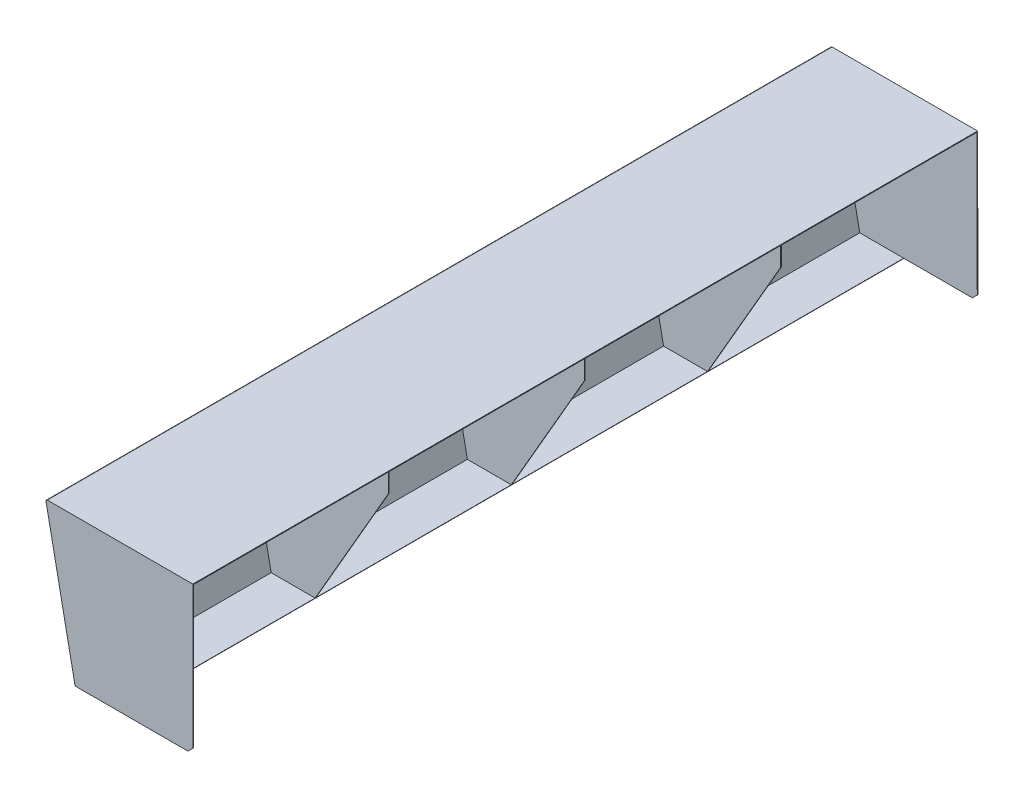
ISO-10303-21;
HEADER;
FILE_DESCRIPTION(('STEP AP214'),'2;1');
FILE_NAME('part.step','',(''),(''),'','','');
FILE_SCHEMA(('AUTOMOTIVE_DESIGN { 1 0 10303 214 1 1 1 1 }'));
ENDSEC;
DATA;
#1=APPLICATION_CONTEXT('core data for automotive mechanical design processes');
#2=APPLICATION_PROTOCOL_DEFINITION('international standard','automotive_design',2000,#1);
#3=PRODUCT_CONTEXT('',#1,'mechanical');
#4=PRODUCT('Part','Part','',(#3));
#5=PRODUCT_RELATED_PRODUCT_CATEGORY('part','',(#4));
#6=PRODUCT_DEFINITION_FORMATION('','',#4);
#7=PRODUCT_DEFINITION_CONTEXT('part definition',#1,'design');
#8=PRODUCT_DEFINITION('design','',#6,#7);
#9=PRODUCT_DEFINITION_SHAPE('','',#8);
#10=(LENGTH_UNIT() NAMED_UNIT(*) SI_UNIT(.MILLI.,.METRE.));
#11=(NAMED_UNIT(*) PLANE_ANGLE_UNIT() SI_UNIT($,.RADIAN.));
#12=(NAMED_UNIT(*) SI_UNIT($,.STERADIAN.) SOLID_ANGLE_UNIT());
#13=UNCERTAINTY_MEASURE_WITH_UNIT(LENGTH_MEASURE(1.E-05),#10,'distance_accuracy_value','');
#14=(GEOMETRIC_REPRESENTATION_CONTEXT(3) GLOBAL_UNCERTAINTY_ASSIGNED_CONTEXT((#13)) GLOBAL_UNIT_ASSIGNED_CONTEXT((#10,
#11,#12)) REPRESENTATION_CONTEXT('',''));
#15=CARTESIAN_POINT('',(0.,0.,0.));
#16=DIRECTION('',(0.,0.,1.));
#17=DIRECTION('',(1.,0.,0.));
#18=AXIS2_PLACEMENT_3D('',#15,#16,#17);
#19=CARTESIAN_POINT('',(300.,260.,0.));
#20=DIRECTION('',(-0.8661855860486,0.499722453489577,0.));
#21=DIRECTION('',(-0.499722453489577,-0.866185586048601,0.));
#22=AXIS2_PLACEMENT_3D('',#19,#20,#21);
#23=PLANE('',#22);
#24=DIRECTION('',(0.,0.,-1.));
#25=VECTOR('',#24,1.);
#26=CARTESIAN_POINT('',(150.865384615385,1.49999999999989,1.5));
#27=LINE('',#26,#25);
#28=CARTESIAN_POINT('',(150.865384615385,1.49999999999989,1.5));
#29=VERTEX_POINT('',#28);
#30=CARTESIAN_POINT('',(150.865384615385,1.49999999999989,0.));
#31=VERTEX_POINT('',#30);
#32=EDGE_CURVE('E255',#29,#31,#27,.T.);
#33=ORIENTED_EDGE('',*,*,#32,.F.);
#34=DIRECTION('',(0.,0.,1.));
#35=VECTOR('',#34,1.);
#36=CARTESIAN_POINT('',(150.865384615385,1.5,1600.));
#37=LINE('',#36,#35);
#38=CARTESIAN_POINT('',(150.865384615385,1.5,400.000000000001));
#39=VERTEX_POINT('',#38);
#40=EDGE_CURVE('E387',#29,#39,#37,.T.);
#41=ORIENTED_EDGE('',*,*,#40,.T.);
#42=DIRECTION('',(0.499722453489577,0.8661855860486,0.));
#43=VECTOR('',#42,1.);
#44=CARTESIAN_POINT('',(150.865384615385,1.5,400.));
#45=LINE('',#44,#43);
#46=CARTESIAN_POINT('',(300.,260.,400.));
#47=VERTEX_POINT('',#46);
#48=EDGE_CURVE('E304',#39,#47,#45,.T.);
#49=ORIENTED_EDGE('',*,*,#48,.T.);
#50=DIRECTION('',(0.,0.,-1.));
#51=VECTOR('',#50,1.);
#52=CARTESIAN_POINT('',(300.,260.,401.5));
#53=LINE('',#52,#51);
#54=CARTESIAN_POINT('',(300.,260.,401.5));
#55=VERTEX_POINT('',#54);
#56=EDGE_CURVE('E297',#55,#47,#53,.T.);
#57=ORIENTED_EDGE('',*,*,#56,.F.);
#58=DIRECTION('',(0.499722453489577,0.8661855860486,0.));
#59=VECTOR('',#58,1.);
#60=CARTESIAN_POINT('',(150.865384615385,1.5,401.5));
#61=LINE('',#60,#59);
#62=CARTESIAN_POINT('',(150.865384615385,1.5,401.500000000001));
#63=VERTEX_POINT('',#62);
#64=EDGE_CURVE('E292',#63,#55,#61,.T.);
#65=ORIENTED_EDGE('',*,*,#64,.F.);
#66=CARTESIAN_POINT('',(150.865384615385,1.5,800.));
#67=VERTEX_POINT('',#66);
#68=EDGE_CURVE('E405',#63,#67,#37,.T.);
#69=ORIENTED_EDGE('',*,*,#68,.T.);
#70=DIRECTION('',(0.499722453489577,0.8661855860486,0.));
#71=VECTOR('',#70,1.);
#72=CARTESIAN_POINT('',(150.865384615385,1.5,800.));
#73=LINE('',#72,#71);
#74=CARTESIAN_POINT('',(300.,260.,800.));
#75=VERTEX_POINT('',#74);
#76=EDGE_CURVE('E335',#67,#75,#73,.T.);
#77=ORIENTED_EDGE('',*,*,#76,.T.);
#78=DIRECTION('',(0.,0.,-1.));
#79=VECTOR('',#78,1.);
#80=CARTESIAN_POINT('',(300.,260.,801.5));
#81=LINE('',#80,#79);
#82=CARTESIAN_POINT('',(300.,260.,801.5));
#83=VERTEX_POINT('',#82);
#84=EDGE_CURVE('E326',#83,#75,#81,.T.);
#85=ORIENTED_EDGE('',*,*,#84,.F.);
#86=DIRECTION('',(0.499722453489577,0.8661855860486,0.));
#87=VECTOR('',#86,1.);
#88=CARTESIAN_POINT('',(150.865384615385,1.5,801.5));
#89=LINE('',#88,#87);
#90=CARTESIAN_POINT('',(150.865384615385,1.5,801.5));
#91=VERTEX_POINT('',#90);
#92=EDGE_CURVE('E321',#91,#83,#89,.T.);
#93=ORIENTED_EDGE('',*,*,#92,.F.);
#94=CARTESIAN_POINT('',(150.865384615385,1.5,1200.));
#95=VERTEX_POINT('',#94);
#96=EDGE_CURVE('E602',#91,#95,#37,.T.);
#97=ORIENTED_EDGE('',*,*,#96,.T.);
#98=DIRECTION('',(0.499722453489577,0.8661855860486,0.));
#99=VECTOR('',#98,1.);
#100=CARTESIAN_POINT('',(150.865384615385,1.5,1200.));
#101=LINE('',#100,#99);
#102=CARTESIAN_POINT('',(300.,260.,1200.));
#103=VERTEX_POINT('',#102);
#104=EDGE_CURVE('E366',#95,#103,#101,.T.);
#105=ORIENTED_EDGE('',*,*,#104,.T.);
#106=DIRECTION('',(0.,0.,-1.));
#107=VECTOR('',#106,1.);
#108=CARTESIAN_POINT('',(300.,260.,1201.5));
#109=LINE('',#108,#107);
#110=CARTESIAN_POINT('',(300.,260.,1201.5));
#111=VERTEX_POINT('',#110);
#112=EDGE_CURVE('E357',#111,#103,#109,.T.);
#113=ORIENTED_EDGE('',*,*,#112,.F.);
#114=DIRECTION('',(0.499722453489577,0.8661855860486,0.));
#115=VECTOR('',#114,1.);
#116=CARTESIAN_POINT('',(150.865384615385,1.5,1201.5));
#117=LINE('',#116,#115);
#118=CARTESIAN_POINT('',(150.865384615385,1.5,1201.5));
#119=VERTEX_POINT('',#118);
#120=EDGE_CURVE('E352',#119,#111,#117,.T.);
#121=ORIENTED_EDGE('',*,*,#120,.F.);
#122=CARTESIAN_POINT('',(150.865384615385,1.49999999999989,1598.5));
#123=VERTEX_POINT('',#122);
#124=EDGE_CURVE('E381',#119,#123,#37,.T.);
#125=ORIENTED_EDGE('',*,*,#124,.T.);
#126=DIRECTION('',(-0.499722453489577,-0.866185586048601,0.));
#127=VECTOR('',#126,1.);
#128=CARTESIAN_POINT('',(300.,260.,1598.5));
#129=LINE('',#128,#127);
#130=CARTESIAN_POINT('',(150.,0.,1598.5));
#131=VERTEX_POINT('',#130);
#132=EDGE_CURVE('E265',#123,#131,#129,.T.);
#133=ORIENTED_EDGE('',*,*,#132,.T.);
#134=DIRECTION('',(0.,0.,1.));
#135=VECTOR('',#134,1.);
#136=CARTESIAN_POINT('',(150.,0.,0.));
#137=LINE('',#136,#135);
#138=CARTESIAN_POINT('',(150.,0.,0.));
#139=VERTEX_POINT('',#138);
#140=EDGE_CURVE('E422',#139,#131,#137,.T.);
#141=ORIENTED_EDGE('',*,*,#140,.F.);
#142=DIRECTION('',(-0.499722453489577,-0.8661855860486,0.));
#143=VECTOR('',#142,1.);
#144=CARTESIAN_POINT('',(300.,260.,0.));
#145=LINE('',#144,#143);
#146=EDGE_CURVE('E420',#31,#139,#145,.T.);
#147=ORIENTED_EDGE('',*,*,#146,.F.);
#148=EDGE_LOOP('',(#33,#41,#49,#57,#65,#69,#77,#85,#93,#97,#105,#113,#121,#125,#133,#141,#147));
#149=FACE_BOUND('',#148,.T.);
#150=ADVANCED_FACE('F35',(#149),#23,.F.);
#151=CARTESIAN_POINT('',(0.,1.5,1600.));
#152=DIRECTION('',(0.,1.,0.));
#153=DIRECTION('',(0.,0.,1.));
#154=AXIS2_PLACEMENT_3D('',#151,#152,#153);
#155=PLANE('',#154);
#156=ORIENTED_EDGE('',*,*,#68,.F.);
#157=DIRECTION('',(1.,0.,0.));
#158=VECTOR('',#157,1.);
#159=CARTESIAN_POINT('',(61.2297058540778,1.5,401.5));
#160=LINE('',#159,#158);
#161=CARTESIAN_POINT('',(61.2297058540778,1.5,401.5));
#162=VERTEX_POINT('',#161);
#163=EDGE_CURVE('E289',#162,#63,#160,.T.);
#164=ORIENTED_EDGE('',*,*,#163,.F.);
#165=DIRECTION('',(0.,0.,1.));
#166=VECTOR('',#165,1.);
#167=CARTESIAN_POINT('',(61.2297058540778,1.5,0.));
#168=LINE('',#167,#166);
#169=CARTESIAN_POINT('',(61.2297058540778,1.5,800.));
#170=VERTEX_POINT('',#169);
#171=EDGE_CURVE('E382',#162,#170,#168,.T.);
#172=ORIENTED_EDGE('',*,*,#171,.T.);
#173=DIRECTION('',(1.,0.,0.));
#174=VECTOR('',#173,1.);
#175=CARTESIAN_POINT('',(61.2297058540778,1.5,800.));
#176=LINE('',#175,#174);
#177=EDGE_CURVE('E332',#170,#67,#176,.T.);
#178=ORIENTED_EDGE('',*,*,#177,.T.);
#179=EDGE_LOOP('',(#156,#164,#172,#178));
#180=FACE_BOUND('',#179,.T.);
#181=ADVANCED_FACE('F481',(#180),#155,.T.);
#182=CARTESIAN_POINT('',(0.,298.5,1600.));
#183=DIRECTION('',(0.,-1.,0.));
#184=DIRECTION('',(0.,0.,-1.));
#185=AXIS2_PLACEMENT_3D('',#182,#183,#184);
#186=PLANE('',#185);
#187=DIRECTION('',(0.,0.,-1.));
#188=VECTOR('',#187,1.);
#189=CARTESIAN_POINT('',(1.82970585407782,298.5,0.));
#190=LINE('',#189,#188);
#191=CARTESIAN_POINT('',(1.82970585407782,298.5,800.));
#192=VERTEX_POINT('',#191);
#193=CARTESIAN_POINT('',(1.82970585407782,298.5,401.5));
#194=VERTEX_POINT('',#193);
#195=EDGE_CURVE('E560',#192,#194,#190,.T.);
#196=ORIENTED_EDGE('',*,*,#195,.T.);
#197=DIRECTION('',(-1.,0.,0.));
#198=VECTOR('',#197,1.);
#199=CARTESIAN_POINT('',(300.,298.5,401.5));
#200=LINE('',#199,#198);
#201=CARTESIAN_POINT('',(300.,298.5,401.5));
#202=VERTEX_POINT('',#201);
#203=EDGE_CURVE('E282',#202,#194,#200,.T.);
#204=ORIENTED_EDGE('',*,*,#203,.F.);
#205=DIRECTION('',(0.,0.,-1.));
#206=VECTOR('',#205,1.);
#207=CARTESIAN_POINT('',(300.,298.5,1600.));
#208=LINE('',#207,#206);
#209=CARTESIAN_POINT('',(300.,298.5,800.));
#210=VERTEX_POINT('',#209);
#211=EDGE_CURVE('E559',#210,#202,#208,.T.);
#212=ORIENTED_EDGE('',*,*,#211,.F.);
#213=DIRECTION('',(-1.,0.,0.));
#214=VECTOR('',#213,1.);
#215=CARTESIAN_POINT('',(300.,298.5,800.));
#216=LINE('',#215,#214);
#217=EDGE_CURVE('E310',#210,#192,#216,.T.);
#218=ORIENTED_EDGE('',*,*,#217,.T.);
#219=EDGE_LOOP('',(#196,#204,#212,#218));
#220=FACE_BOUND('',#219,.T.);
#221=ADVANCED_FACE('F488',(#220),#186,.T.);
#222=CARTESIAN_POINT('',(61.4708710135364,0.294174202707276,0.));
#223=DIRECTION('',(0.98058067569092,0.196116135138184,0.));
#224=DIRECTION('',(-0.196116135138184,0.98058067569092,0.));
#225=AXIS2_PLACEMENT_3D('',#222,#223,#224);
#226=PLANE('',#225);
#227=ORIENTED_EDGE('',*,*,#171,.F.);
#228=DIRECTION('',(0.196116135138184,-0.98058067569092,0.));
#229=VECTOR('',#228,1.);
#230=CARTESIAN_POINT('',(1.82970585407782,298.5,401.5));
#231=LINE('',#230,#229);
#232=EDGE_CURVE('E285',#194,#162,#231,.T.);
#233=ORIENTED_EDGE('',*,*,#232,.F.);
#234=ORIENTED_EDGE('',*,*,#195,.F.);
#235=DIRECTION('',(0.196116135138184,-0.98058067569092,0.));
#236=VECTOR('',#235,1.);
#237=CARTESIAN_POINT('',(1.82970585407782,298.5,800.));
#238=LINE('',#237,#236);
#239=EDGE_CURVE('E329',#192,#170,#238,.T.);
#240=ORIENTED_EDGE('',*,*,#239,.T.);
#241=EDGE_LOOP('',(#227,#233,#234,#240));
#242=FACE_BOUND('',#241,.T.);
#243=ADVANCED_FACE('F530',(#242),#226,.T.);
#244=ORIENTED_EDGE('',*,*,#96,.F.);
#245=DIRECTION('',(1.,0.,0.));
#246=VECTOR('',#245,1.);
#247=CARTESIAN_POINT('',(61.2297058540778,1.5,801.5));
#248=LINE('',#247,#246);
#249=CARTESIAN_POINT('',(61.2297058540778,1.5,801.5));
#250=VERTEX_POINT('',#249);
#251=EDGE_CURVE('E318',#250,#91,#248,.T.);
#252=ORIENTED_EDGE('',*,*,#251,.F.);
#253=CARTESIAN_POINT('',(61.2297058540778,1.5,1200.));
#254=VERTEX_POINT('',#253);
#255=EDGE_CURVE('E553',#250,#254,#168,.T.);
#256=ORIENTED_EDGE('',*,*,#255,.T.);
#257=DIRECTION('',(1.,0.,0.));
#258=VECTOR('',#257,1.);
#259=CARTESIAN_POINT('',(61.2297058540778,1.5,1200.));
#260=LINE('',#259,#258);
#261=EDGE_CURVE('E363',#254,#95,#260,.T.);
#262=ORIENTED_EDGE('',*,*,#261,.T.);
#263=EDGE_LOOP('',(#244,#252,#256,#262));
#264=FACE_BOUND('',#263,.T.);
#265=ADVANCED_FACE('F491',(#264),#155,.T.);
#266=CARTESIAN_POINT('',(1.82970585407782,298.5,1200.));
#267=VERTEX_POINT('',#266);
#268=CARTESIAN_POINT('',(1.82970585407782,298.5,801.5));
#269=VERTEX_POINT('',#268);
#270=EDGE_CURVE('E400',#267,#269,#190,.T.);
#271=ORIENTED_EDGE('',*,*,#270,.T.);
#272=DIRECTION('',(-1.,0.,0.));
#273=VECTOR('',#272,1.);
#274=CARTESIAN_POINT('',(300.,298.5,801.5));
#275=LINE('',#274,#273);
#276=CARTESIAN_POINT('',(300.,298.5,801.5));
#277=VERTEX_POINT('',#276);
#278=EDGE_CURVE('E311',#277,#269,#275,.T.);
#279=ORIENTED_EDGE('',*,*,#278,.F.);
#280=CARTESIAN_POINT('',(300.,298.5,1200.));
#281=VERTEX_POINT('',#280);
#282=EDGE_CURVE('E411',#281,#277,#208,.T.);
#283=ORIENTED_EDGE('',*,*,#282,.F.);
#284=DIRECTION('',(-1.,0.,0.));
#285=VECTOR('',#284,1.);
#286=CARTESIAN_POINT('',(300.,298.5,1200.));
#287=LINE('',#286,#285);
#288=EDGE_CURVE('E341',#281,#267,#287,.T.);
#289=ORIENTED_EDGE('',*,*,#288,.T.);
#290=EDGE_LOOP('',(#271,#279,#283,#289));
#291=FACE_BOUND('',#290,.T.);
#292=ADVANCED_FACE('F524',(#291),#186,.T.);
#293=ORIENTED_EDGE('',*,*,#255,.F.);
#294=DIRECTION('',(0.196116135138184,-0.98058067569092,0.));
#295=VECTOR('',#294,1.);
#296=CARTESIAN_POINT('',(1.82970585407782,298.5,801.5));
#297=LINE('',#296,#295);
#298=EDGE_CURVE('E314',#269,#250,#297,.T.);
#299=ORIENTED_EDGE('',*,*,#298,.F.);
#300=ORIENTED_EDGE('',*,*,#270,.F.);
#301=DIRECTION('',(0.196116135138184,-0.98058067569092,0.));
#302=VECTOR('',#301,1.);
#303=CARTESIAN_POINT('',(1.82970585407782,298.5,1200.));
#304=LINE('',#303,#302);
#305=EDGE_CURVE('E360',#267,#254,#304,.T.);
#306=ORIENTED_EDGE('',*,*,#305,.T.);
#307=EDGE_LOOP('',(#293,#299,#300,#306));
#308=FACE_BOUND('',#307,.T.);
#309=ADVANCED_FACE('F515',(#308),#226,.T.);
#310=ORIENTED_EDGE('',*,*,#124,.F.);
#311=DIRECTION('',(1.,0.,0.));
#312=VECTOR('',#311,1.);
#313=CARTESIAN_POINT('',(61.2297058540778,1.5,1201.5));
#314=LINE('',#313,#312);
#315=CARTESIAN_POINT('',(61.2297058540778,1.5,1201.5));
#316=VERTEX_POINT('',#315);
#317=EDGE_CURVE('E349',#316,#119,#314,.T.);
#318=ORIENTED_EDGE('',*,*,#317,.F.);
#319=CARTESIAN_POINT('',(61.2297058540778,1.5,1598.5));
#320=VERTEX_POINT('',#319);
#321=EDGE_CURVE('E383',#316,#320,#168,.T.);
#322=ORIENTED_EDGE('',*,*,#321,.T.);
#323=DIRECTION('',(1.,0.,0.));
#324=VECTOR('',#323,1.);
#325=CARTESIAN_POINT('',(0.,1.5,1598.5));
#326=LINE('',#325,#324);
#327=EDGE_CURVE('E373',#320,#123,#326,.T.);
#328=ORIENTED_EDGE('',*,*,#327,.T.);
#329=EDGE_LOOP('',(#310,#318,#322,#328));
#330=FACE_BOUND('',#329,.T.);
#331=ADVANCED_FACE('F520',(#330),#155,.T.);
#332=CARTESIAN_POINT('',(1.82970585407782,298.5,1598.5));
#333=VERTEX_POINT('',#332);
#334=CARTESIAN_POINT('',(1.82970585407782,298.5,1201.5));
#335=VERTEX_POINT('',#334);
#336=EDGE_CURVE('E396',#333,#335,#190,.T.);
#337=ORIENTED_EDGE('',*,*,#336,.T.);
#338=DIRECTION('',(-1.,0.,0.));
#339=VECTOR('',#338,1.);
#340=CARTESIAN_POINT('',(300.,298.5,1201.5));
#341=LINE('',#340,#339);
#342=CARTESIAN_POINT('',(300.,298.5,1201.5));
#343=VERTEX_POINT('',#342);
#344=EDGE_CURVE('E342',#343,#335,#341,.T.);
#345=ORIENTED_EDGE('',*,*,#344,.F.);
#346=CARTESIAN_POINT('',(300.,298.5,1598.5));
#347=VERTEX_POINT('',#346);
#348=EDGE_CURVE('E407',#347,#343,#208,.T.);
#349=ORIENTED_EDGE('',*,*,#348,.F.);
#350=DIRECTION('',(-1.,0.,0.));
#351=VECTOR('',#350,1.);
#352=CARTESIAN_POINT('',(0.,298.5,1598.5));
#353=LINE('',#352,#351);
#354=EDGE_CURVE('E388',#347,#333,#353,.T.);
#355=ORIENTED_EDGE('',*,*,#354,.T.);
#356=EDGE_LOOP('',(#337,#345,#349,#355));
#357=FACE_BOUND('',#356,.T.);
#358=ADVANCED_FACE('F512',(#357),#186,.T.);
#359=ORIENTED_EDGE('',*,*,#321,.F.);
#360=DIRECTION('',(0.196116135138184,-0.98058067569092,0.));
#361=VECTOR('',#360,1.);
#362=CARTESIAN_POINT('',(1.82970585407782,298.5,1201.5));
#363=LINE('',#362,#361);
#364=EDGE_CURVE('E345',#335,#316,#363,.T.);
#365=ORIENTED_EDGE('',*,*,#364,.F.);
#366=ORIENTED_EDGE('',*,*,#336,.F.);
#367=DIRECTION('',(-0.196116135138184,0.98058067569092,0.));
#368=VECTOR('',#367,1.);
#369=CARTESIAN_POINT('',(61.4708710135364,0.294174202707276,1598.5));
#370=LINE('',#369,#368);
#371=EDGE_CURVE('E372',#320,#333,#370,.T.);
#372=ORIENTED_EDGE('',*,*,#371,.F.);
#373=EDGE_LOOP('',(#359,#365,#366,#372));
#374=FACE_BOUND('',#373,.T.);
#375=ADVANCED_FACE('F507',(#374),#226,.T.);
#376=CARTESIAN_POINT('',(0.,0.,1600.));
#377=DIRECTION('',(0.,1.,0.));
#378=DIRECTION('',(0.,0.,1.));
#379=AXIS2_PLACEMENT_3D('',#376,#377,#378);
#380=PLANE('',#379);
#381=DIRECTION('',(1.,0.,0.));
#382=VECTOR('',#381,1.);
#383=CARTESIAN_POINT('',(0.,0.,1600.));
#384=LINE('',#383,#382);
#385=CARTESIAN_POINT('',(60.,0.,1600.));
#386=VERTEX_POINT('',#385);
#387=CARTESIAN_POINT('',(290.,0.,1600.));
#388=VERTEX_POINT('',#387);
#389=EDGE_CURVE('E427',#386,#388,#384,.T.);
#390=ORIENTED_EDGE('',*,*,#389,.F.);
#391=DIRECTION('',(0.,0.,1.));
#392=VECTOR('',#391,1.);
#393=CARTESIAN_POINT('',(60.,0.,0.));
#394=LINE('',#393,#392);
#395=CARTESIAN_POINT('',(60.,0.,0.));
#396=VERTEX_POINT('',#395);
#397=EDGE_CURVE('E416',#396,#386,#394,.T.);
#398=ORIENTED_EDGE('',*,*,#397,.F.);
#399=DIRECTION('',(1.,0.,0.));
#400=VECTOR('',#399,1.);
#401=CARTESIAN_POINT('',(0.,0.,0.));
#402=LINE('',#401,#400);
#403=EDGE_CURVE('E425',#396,#139,#402,.T.);
#404=ORIENTED_EDGE('',*,*,#403,.T.);
#405=ORIENTED_EDGE('',*,*,#140,.T.);
#406=DIRECTION('',(1.,0.,0.));
#407=VECTOR('',#406,1.);
#408=CARTESIAN_POINT('',(290.,0.,1598.5));
#409=LINE('',#408,#407);
#410=CARTESIAN_POINT('',(290.,0.,1598.5));
#411=VERTEX_POINT('',#410);
#412=EDGE_CURVE('E258',#131,#411,#409,.T.);
#413=ORIENTED_EDGE('',*,*,#412,.T.);
#414=DIRECTION('',(0.,0.,1.));
#415=VECTOR('',#414,1.);
#416=CARTESIAN_POINT('',(290.,0.,1598.5));
#417=LINE('',#416,#415);
#418=EDGE_CURVE('E274',#411,#388,#417,.T.);
#419=ORIENTED_EDGE('',*,*,#418,.T.);
#420=EDGE_LOOP('',(#390,#398,#404,#405,#413,#419));
#421=FACE_BOUND('',#420,.T.);
#422=ADVANCED_FACE('F456',(#421),#380,.F.);
#423=CARTESIAN_POINT('',(300.,0.,1600.));
#424=DIRECTION('',(-1.,0.,0.));
#425=DIRECTION('',(0.,0.,1.));
#426=AXIS2_PLACEMENT_3D('',#423,#424,#425);
#427=PLANE('',#426);
#428=DIRECTION('',(0.,1.,0.));
#429=VECTOR('',#428,1.);
#430=CARTESIAN_POINT('',(300.,0.,1600.));
#431=LINE('',#430,#429);
#432=CARTESIAN_POINT('',(300.,10.,1600.));
#433=VERTEX_POINT('',#432);
#434=CARTESIAN_POINT('',(300.,300.,1600.));
#435=VERTEX_POINT('',#434);
#436=EDGE_CURVE('E429',#433,#435,#431,.T.);
#437=ORIENTED_EDGE('',*,*,#436,.F.);
#438=DIRECTION('',(0.,0.,1.));
#439=VECTOR('',#438,1.);
#440=CARTESIAN_POINT('',(300.,10.,1598.5));
#441=LINE('',#440,#439);
#442=CARTESIAN_POINT('',(300.,10.,1598.5));
#443=VERTEX_POINT('',#442);
#444=EDGE_CURVE('E276',#443,#433,#441,.T.);
#445=ORIENTED_EDGE('',*,*,#444,.F.);
#446=DIRECTION('',(0.,1.,0.));
#447=VECTOR('',#446,1.);
#448=CARTESIAN_POINT('',(300.,0.,1598.5));
#449=LINE('',#448,#447);
#450=EDGE_CURVE('E376',#443,#347,#449,.T.);
#451=ORIENTED_EDGE('',*,*,#450,.T.);
#452=ORIENTED_EDGE('',*,*,#348,.T.);
#453=DIRECTION('',(0.,1.,0.));
#454=VECTOR('',#453,1.);
#455=CARTESIAN_POINT('',(300.,260.,1201.5));
#456=LINE('',#455,#454);
#457=EDGE_CURVE('E354',#111,#343,#456,.T.);
#458=ORIENTED_EDGE('',*,*,#457,.F.);
#459=ORIENTED_EDGE('',*,*,#112,.T.);
#460=DIRECTION('',(0.,1.,0.));
#461=VECTOR('',#460,1.);
#462=CARTESIAN_POINT('',(300.,260.,1200.));
#463=LINE('',#462,#461);
#464=EDGE_CURVE('E346',#103,#281,#463,.T.);
#465=ORIENTED_EDGE('',*,*,#464,.T.);
#466=ORIENTED_EDGE('',*,*,#282,.T.);
#467=DIRECTION('',(0.,1.,0.));
#468=VECTOR('',#467,1.);
#469=CARTESIAN_POINT('',(300.,260.,801.5));
#470=LINE('',#469,#468);
#471=EDGE_CURVE('E323',#83,#277,#470,.T.);
#472=ORIENTED_EDGE('',*,*,#471,.F.);
#473=ORIENTED_EDGE('',*,*,#84,.T.);
#474=DIRECTION('',(0.,1.,0.));
#475=VECTOR('',#474,1.);
#476=CARTESIAN_POINT('',(300.,260.,800.));
#477=LINE('',#476,#475);
#478=EDGE_CURVE('E315',#75,#210,#477,.T.);
#479=ORIENTED_EDGE('',*,*,#478,.T.);
#480=ORIENTED_EDGE('',*,*,#211,.T.);
#481=DIRECTION('',(0.,1.,0.));
#482=VECTOR('',#481,1.);
#483=CARTESIAN_POINT('',(300.,260.,401.5));
#484=LINE('',#483,#482);
#485=EDGE_CURVE('E294',#55,#202,#484,.T.);
#486=ORIENTED_EDGE('',*,*,#485,.F.);
#487=ORIENTED_EDGE('',*,*,#56,.T.);
#488=DIRECTION('',(0.,1.,0.));
#489=VECTOR('',#488,1.);
#490=CARTESIAN_POINT('',(300.,260.,400.));
#491=LINE('',#490,#489);
#492=CARTESIAN_POINT('',(300.,298.5,400.));
#493=VERTEX_POINT('',#492);
#494=EDGE_CURVE('E286',#47,#493,#491,.T.);
#495=ORIENTED_EDGE('',*,*,#494,.T.);
#496=CARTESIAN_POINT('',(300.,298.5,1.5));
#497=VERTEX_POINT('',#496);
#498=EDGE_CURVE('E399',#493,#497,#208,.T.);
#499=ORIENTED_EDGE('',*,*,#498,.T.);
#500=DIRECTION('',(0.,1.,0.));
#501=VECTOR('',#500,1.);
#502=CARTESIAN_POINT('',(300.,0.,1.5));
#503=LINE('',#502,#501);
#504=CARTESIAN_POINT('',(300.,260.,1.5));
#505=VERTEX_POINT('',#504);
#506=EDGE_CURVE('E386',#505,#497,#503,.T.);
#507=ORIENTED_EDGE('',*,*,#506,.F.);
#508=DIRECTION('',(0.,0.,1.));
#509=VECTOR('',#508,1.);
#510=CARTESIAN_POINT('',(300.,260.,0.));
#511=LINE('',#510,#509);
#512=CARTESIAN_POINT('',(300.,260.,0.));
#513=VERTEX_POINT('',#512);
#514=EDGE_CURVE('E237',#513,#505,#511,.T.);
#515=ORIENTED_EDGE('',*,*,#514,.F.);
#516=DIRECTION('',(0.,1.,0.));
#517=VECTOR('',#516,1.);
#518=CARTESIAN_POINT('',(300.,0.,0.));
#519=LINE('',#518,#517);
#520=CARTESIAN_POINT('',(300.,300.,0.));
#521=VERTEX_POINT('',#520);
#522=EDGE_CURVE('E436',#513,#521,#519,.T.);
#523=ORIENTED_EDGE('',*,*,#522,.T.);
#524=DIRECTION('',(0.,0.,-1.));
#525=VECTOR('',#524,1.);
#526=CARTESIAN_POINT('',(300.,300.,1600.));
#527=LINE('',#526,#525);
#528=EDGE_CURVE('E269',#435,#521,#527,.T.);
#529=ORIENTED_EDGE('',*,*,#528,.F.);
#530=EDGE_LOOP('',(#437,#445,#451,#452,#458,#459,#465,#466,#472,#473,#479,#480,#486,#487,#495,
#499,#507,#515,#523,#529));
#531=FACE_BOUND('',#530,.T.);
#532=ADVANCED_FACE('F503',(#531),#427,.F.);
#533=CARTESIAN_POINT('',(0.,300.,1600.));
#534=DIRECTION('',(0.,-1.,0.));
#535=DIRECTION('',(0.,0.,-1.));
#536=AXIS2_PLACEMENT_3D('',#533,#534,#535);
#537=PLANE('',#536);
#538=DIRECTION('',(-1.,0.,0.));
#539=VECTOR('',#538,1.);
#540=CARTESIAN_POINT('',(0.,300.,0.));
#541=LINE('',#540,#539);
#542=CARTESIAN_POINT('',(3.65941170815567,300.,0.));
#543=VERTEX_POINT('',#542);
#544=EDGE_CURVE('E430',#521,#543,#541,.T.);
#545=ORIENTED_EDGE('',*,*,#544,.T.);
#546=DIRECTION('',(0.,0.,-1.));
#547=VECTOR('',#546,1.);
#548=CARTESIAN_POINT('',(3.65941170815567,300.,1600.));
#549=LINE('',#548,#547);
#550=CARTESIAN_POINT('',(3.65941170815567,300.,1600.));
#551=VERTEX_POINT('',#550);
#552=EDGE_CURVE('E43',#543,#551,#549,.F.);
#553=ORIENTED_EDGE('',*,*,#552,.T.);
#554=DIRECTION('',(-1.,0.,0.));
#555=VECTOR('',#554,1.);
#556=CARTESIAN_POINT('',(0.,300.,1600.));
#557=LINE('',#556,#555);
#558=EDGE_CURVE('E432',#435,#551,#557,.T.);
#559=ORIENTED_EDGE('',*,*,#558,.F.);
#560=ORIENTED_EDGE('',*,*,#528,.T.);
#561=EDGE_LOOP('',(#545,#553,#559,#560));
#562=FACE_BOUND('',#561,.T.);
#563=ADVANCED_FACE('F498',(#562),#537,.F.);
#564=CARTESIAN_POINT('',(0.,0.,1600.));
#565=DIRECTION('',(0.,0.,-1.));
#566=DIRECTION('',(-1.,0.,0.));
#567=AXIS2_PLACEMENT_3D('',#564,#565,#566);
#568=PLANE('',#567);
#569=ORIENTED_EDGE('',*,*,#558,.T.);
#570=CARTESIAN_POINT('',(3.65941170815567,297.,1600.));
#571=DIRECTION('',(0.,0.,-1.));
#572=DIRECTION('',(-1.,0.,0.));
#573=AXIS2_PLACEMENT_3D('',#570,#571,#572);
#574=CIRCLE('',#573,3.);
#575=CARTESIAN_POINT('',(0.717669681082916,296.411651594585,1600.));
#576=VERTEX_POINT('',#575);
#577=EDGE_CURVE('E11',#551,#576,#574,.F.);
#578=ORIENTED_EDGE('',*,*,#577,.T.);
#579=DIRECTION('',(-0.196116135138184,0.98058067569092,0.));
#580=VECTOR('',#579,1.);
#581=CARTESIAN_POINT('',(60.,0.,1600.));
#582=LINE('',#581,#580);
#583=EDGE_CURVE('E410',#386,#576,#582,.T.);
#584=ORIENTED_EDGE('',*,*,#583,.F.);
#585=ORIENTED_EDGE('',*,*,#389,.T.);
#586=DIRECTION('',(0.707106781186548,0.707106781186547,0.));
#587=VECTOR('',#586,1.);
#588=CARTESIAN_POINT('',(300.,10.,1600.));
#589=LINE('',#588,#587);
#590=EDGE_CURVE('E254',#388,#433,#589,.T.);
#591=ORIENTED_EDGE('',*,*,#590,.T.);
#592=ORIENTED_EDGE('',*,*,#436,.T.);
#593=EDGE_LOOP('',(#569,#578,#584,#585,#591,#592));
#594=FACE_BOUND('',#593,.T.);
#595=ADVANCED_FACE('F471',(#594),#568,.F.);
#596=CARTESIAN_POINT('',(0.,0.,0.));
#597=DIRECTION('',(0.,0.,-1.));
#598=DIRECTION('',(-1.,0.,0.));
#599=AXIS2_PLACEMENT_3D('',#596,#597,#598);
#600=PLANE('',#599);
#601=DIRECTION('',(-0.196116135138184,0.98058067569092,0.));
#602=VECTOR('',#601,1.);
#603=CARTESIAN_POINT('',(60.,0.,0.));
#604=LINE('',#603,#602);
#605=CARTESIAN_POINT('',(0.717669681082916,296.411651594585,0.));
#606=VERTEX_POINT('',#605);
#607=EDGE_CURVE('E414',#396,#606,#604,.T.);
#608=ORIENTED_EDGE('',*,*,#607,.T.);
#609=CARTESIAN_POINT('',(3.65941170815567,297.,0.));
#610=DIRECTION('',(0.,0.,-1.));
#611=DIRECTION('',(-1.,0.,0.));
#612=AXIS2_PLACEMENT_3D('',#609,#610,#611);
#613=CIRCLE('',#612,3.);
#614=EDGE_CURVE('E57',#606,#543,#613,.T.);
#615=ORIENTED_EDGE('',*,*,#614,.T.);
#616=ORIENTED_EDGE('',*,*,#544,.F.);
#617=ORIENTED_EDGE('',*,*,#522,.F.);
#618=DIRECTION('',(-0.00334769735456374,0.999994396445511,0.));
#619=VECTOR('',#618,1.);
#620=CARTESIAN_POINT('',(300.831907641839,11.499943964455,0.));
#621=LINE('',#620,#619);
#622=CARTESIAN_POINT('',(300.831907641839,11.499943964455,0.));
#623=VERTEX_POINT('',#622);
#624=EDGE_CURVE('E578',#623,#513,#621,.T.);
#625=ORIENTED_EDGE('',*,*,#624,.F.);
#626=DIRECTION('',(0.705922199199541,0.708289382016477,0.));
#627=VECTOR('',#626,1.);
#628=CARTESIAN_POINT('',(290.865384615385,1.49999999999987,0.));
#629=LINE('',#628,#627);
#630=CARTESIAN_POINT('',(290.865384615385,1.49999999999987,0.));
#631=VERTEX_POINT('',#630);
#632=EDGE_CURVE('E253',#631,#623,#629,.T.);
#633=ORIENTED_EDGE('',*,*,#632,.F.);
#634=DIRECTION('',(1.,0.,0.));
#635=VECTOR('',#634,1.);
#636=CARTESIAN_POINT('',(150.865384615385,1.49999999999989,0.));
#637=LINE('',#636,#635);
#638=EDGE_CURVE('E249',#31,#631,#637,.T.);
#639=ORIENTED_EDGE('',*,*,#638,.F.);
#640=ORIENTED_EDGE('',*,*,#146,.T.);
#641=ORIENTED_EDGE('',*,*,#403,.F.);
#642=EDGE_LOOP('',(#608,#615,#616,#617,#625,#633,#639,#640,#641));
#643=FACE_BOUND('',#642,.T.);
#644=ADVANCED_FACE('F451',(#643),#600,.T.);
#645=CARTESIAN_POINT('',(60.,0.,0.));
#646=DIRECTION('',(0.98058067569092,0.196116135138184,0.));
#647=DIRECTION('',(-0.196116135138184,0.98058067569092,0.));
#648=AXIS2_PLACEMENT_3D('',#645,#646,#647);
#649=PLANE('',#648);
#650=ORIENTED_EDGE('',*,*,#583,.T.);
#651=DIRECTION('',(0.,0.,-1.));
#652=VECTOR('',#651,1.);
#653=CARTESIAN_POINT('',(0.71766968108291,296.411651594585,0.));
#654=LINE('',#653,#652);
#655=EDGE_CURVE('E268',#576,#606,#654,.T.);
#656=ORIENTED_EDGE('',*,*,#655,.T.);
#657=ORIENTED_EDGE('',*,*,#607,.F.);
#658=ORIENTED_EDGE('',*,*,#397,.T.);
#659=EDGE_LOOP('',(#650,#656,#657,#658));
#660=FACE_BOUND('',#659,.T.);
#661=ADVANCED_FACE('F445',(#660),#649,.F.);
#662=DIRECTION('',(1.,0.,0.));
#663=VECTOR('',#662,1.);
#664=CARTESIAN_POINT('',(61.2297058540778,1.5,400.));
#665=LINE('',#664,#663);
#666=CARTESIAN_POINT('',(61.2297058540778,1.5,400.));
#667=VERTEX_POINT('',#666);
#668=EDGE_CURVE('E302',#667,#39,#665,.T.);
#669=ORIENTED_EDGE('',*,*,#668,.T.);
#670=ORIENTED_EDGE('',*,*,#40,.F.);
#671=DIRECTION('',(1.,0.,0.));
#672=VECTOR('',#671,1.);
#673=CARTESIAN_POINT('',(0.,1.5,1.5));
#674=LINE('',#673,#672);
#675=CARTESIAN_POINT('',(61.2297058540778,1.5,1.5));
#676=VERTEX_POINT('',#675);
#677=EDGE_CURVE('E384',#676,#29,#674,.T.);
#678=ORIENTED_EDGE('',*,*,#677,.F.);
#679=EDGE_CURVE('E378',#676,#667,#168,.T.);
#680=ORIENTED_EDGE('',*,*,#679,.T.);
#681=EDGE_LOOP('',(#669,#670,#678,#680));
#682=FACE_BOUND('',#681,.T.);
#683=ADVANCED_FACE('F492',(#682),#155,.T.);
#684=DIRECTION('',(-1.,0.,0.));
#685=VECTOR('',#684,1.);
#686=CARTESIAN_POINT('',(300.,298.5,400.));
#687=LINE('',#686,#685);
#688=CARTESIAN_POINT('',(1.82970585407782,298.5,400.));
#689=VERTEX_POINT('',#688);
#690=EDGE_CURVE('E279',#493,#689,#687,.T.);
#691=ORIENTED_EDGE('',*,*,#690,.T.);
#692=CARTESIAN_POINT('',(1.82970585407782,298.5,1.5));
#693=VERTEX_POINT('',#692);
#694=EDGE_CURVE('E391',#689,#693,#190,.T.);
#695=ORIENTED_EDGE('',*,*,#694,.T.);
#696=DIRECTION('',(-1.,0.,0.));
#697=VECTOR('',#696,1.);
#698=CARTESIAN_POINT('',(0.,298.5,1.5));
#699=LINE('',#698,#697);
#700=EDGE_CURVE('E377',#497,#693,#699,.T.);
#701=ORIENTED_EDGE('',*,*,#700,.F.);
#702=ORIENTED_EDGE('',*,*,#498,.F.);
#703=EDGE_LOOP('',(#691,#695,#701,#702));
#704=FACE_BOUND('',#703,.T.);
#705=ADVANCED_FACE('F523',(#704),#186,.T.);
#706=CARTESIAN_POINT('',(0.,0.,1598.5));
#707=DIRECTION('',(0.,0.,-1.));
#708=DIRECTION('',(-1.,0.,0.));
#709=AXIS2_PLACEMENT_3D('',#706,#707,#708);
#710=PLANE('',#709);
#711=ORIENTED_EDGE('',*,*,#354,.F.);
#712=ORIENTED_EDGE('',*,*,#450,.F.);
#713=DIRECTION('',(0.707106781186548,0.707106781186547,0.));
#714=VECTOR('',#713,1.);
#715=CARTESIAN_POINT('',(300.,10.,1598.5));
#716=LINE('',#715,#714);
#717=EDGE_CURVE('E272',#411,#443,#716,.T.);
#718=ORIENTED_EDGE('',*,*,#717,.F.);
#719=ORIENTED_EDGE('',*,*,#412,.F.);
#720=ORIENTED_EDGE('',*,*,#132,.F.);
#721=ORIENTED_EDGE('',*,*,#327,.F.);
#722=ORIENTED_EDGE('',*,*,#371,.T.);
#723=EDGE_LOOP('',(#711,#712,#718,#719,#720,#721,#722));
#724=FACE_BOUND('',#723,.T.);
#725=ADVANCED_FACE('F464',(#724),#710,.T.);
#726=CARTESIAN_POINT('',(0.,0.,1.5));
#727=DIRECTION('',(0.,0.,-1.));
#728=DIRECTION('',(-1.,0.,0.));
#729=AXIS2_PLACEMENT_3D('',#726,#727,#728);
#730=PLANE('',#729);
#731=DIRECTION('',(-0.196116135138184,0.98058067569092,0.));
#732=VECTOR('',#731,1.);
#733=CARTESIAN_POINT('',(61.4708710135364,0.294174202707276,1.5));
#734=LINE('',#733,#732);
#735=EDGE_CURVE('E393',#676,#693,#734,.T.);
#736=ORIENTED_EDGE('',*,*,#735,.F.);
#737=ORIENTED_EDGE('',*,*,#677,.T.);
#738=DIRECTION('',(1.,0.,0.));
#739=VECTOR('',#738,1.);
#740=CARTESIAN_POINT('',(150.865384615385,1.49999999999989,1.5));
#741=LINE('',#740,#739);
#742=CARTESIAN_POINT('',(290.865384615385,1.49999999999987,1.5));
#743=VERTEX_POINT('',#742);
#744=EDGE_CURVE('E240',#29,#743,#741,.T.);
#745=ORIENTED_EDGE('',*,*,#744,.T.);
#746=DIRECTION('',(0.705922199199541,0.708289382016477,0.));
#747=VECTOR('',#746,1.);
#748=CARTESIAN_POINT('',(290.865384615385,1.49999999999987,1.5));
#749=LINE('',#748,#747);
#750=CARTESIAN_POINT('',(300.831907641839,11.499943964455,1.5));
#751=VERTEX_POINT('',#750);
#752=EDGE_CURVE('E241',#743,#751,#749,.T.);
#753=ORIENTED_EDGE('',*,*,#752,.T.);
#754=DIRECTION('',(-0.00334769735456374,0.999994396445511,0.));
#755=VECTOR('',#754,1.);
#756=CARTESIAN_POINT('',(300.831907641839,11.499943964455,1.5));
#757=LINE('',#756,#755);
#758=EDGE_CURVE('E230',#751,#505,#757,.T.);
#759=ORIENTED_EDGE('',*,*,#758,.T.);
#760=ORIENTED_EDGE('',*,*,#506,.T.);
#761=ORIENTED_EDGE('',*,*,#700,.T.);
#762=EDGE_LOOP('',(#736,#737,#745,#753,#759,#760,#761));
#763=FACE_BOUND('',#762,.T.);
#764=ADVANCED_FACE('F244',(#763),#730,.F.);
#765=DIRECTION('',(0.196116135138184,-0.98058067569092,0.));
#766=VECTOR('',#765,1.);
#767=CARTESIAN_POINT('',(1.82970585407782,298.5,400.));
#768=LINE('',#767,#766);
#769=EDGE_CURVE('E300',#689,#667,#768,.T.);
#770=ORIENTED_EDGE('',*,*,#769,.T.);
#771=ORIENTED_EDGE('',*,*,#679,.F.);
#772=ORIENTED_EDGE('',*,*,#735,.T.);
#773=ORIENTED_EDGE('',*,*,#694,.F.);
#774=EDGE_LOOP('',(#770,#771,#772,#773));
#775=FACE_BOUND('',#774,.T.);
#776=ADVANCED_FACE('F514',(#775),#226,.T.);
#777=CARTESIAN_POINT('',(0.,0.,1201.5));
#778=DIRECTION('',(0.,0.,-1.));
#779=DIRECTION('',(-1.,0.,0.));
#780=AXIS2_PLACEMENT_3D('',#777,#778,#779);
#781=PLANE('',#780);
#782=ORIENTED_EDGE('',*,*,#344,.T.);
#783=ORIENTED_EDGE('',*,*,#364,.T.);
#784=ORIENTED_EDGE('',*,*,#317,.T.);
#785=ORIENTED_EDGE('',*,*,#120,.T.);
#786=ORIENTED_EDGE('',*,*,#457,.T.);
#787=EDGE_LOOP('',(#782,#783,#784,#785,#786));
#788=FACE_BOUND('',#787,.T.);
#789=ADVANCED_FACE('F528',(#788),#781,.F.);
#790=CARTESIAN_POINT('',(0.,0.,1200.));
#791=DIRECTION('',(0.,0.,-1.));
#792=DIRECTION('',(-1.,0.,0.));
#793=AXIS2_PLACEMENT_3D('',#790,#791,#792);
#794=PLANE('',#793);
#795=ORIENTED_EDGE('',*,*,#288,.F.);
#796=ORIENTED_EDGE('',*,*,#464,.F.);
#797=ORIENTED_EDGE('',*,*,#104,.F.);
#798=ORIENTED_EDGE('',*,*,#261,.F.);
#799=ORIENTED_EDGE('',*,*,#305,.F.);
#800=EDGE_LOOP('',(#795,#796,#797,#798,#799));
#801=FACE_BOUND('',#800,.T.);
#802=ADVANCED_FACE('F590',(#801),#794,.T.);
#803=CARTESIAN_POINT('',(0.,0.,801.5));
#804=DIRECTION('',(0.,0.,-1.));
#805=DIRECTION('',(-1.,0.,0.));
#806=AXIS2_PLACEMENT_3D('',#803,#804,#805);
#807=PLANE('',#806);
#808=ORIENTED_EDGE('',*,*,#278,.T.);
#809=ORIENTED_EDGE('',*,*,#298,.T.);
#810=ORIENTED_EDGE('',*,*,#251,.T.);
#811=ORIENTED_EDGE('',*,*,#92,.T.);
#812=ORIENTED_EDGE('',*,*,#471,.T.);
#813=EDGE_LOOP('',(#808,#809,#810,#811,#812));
#814=FACE_BOUND('',#813,.T.);
#815=ADVANCED_FACE('F596',(#814),#807,.F.);
#816=CARTESIAN_POINT('',(0.,0.,800.));
#817=DIRECTION('',(0.,0.,-1.));
#818=DIRECTION('',(-1.,0.,0.));
#819=AXIS2_PLACEMENT_3D('',#816,#817,#818);
#820=PLANE('',#819);
#821=ORIENTED_EDGE('',*,*,#217,.F.);
#822=ORIENTED_EDGE('',*,*,#478,.F.);
#823=ORIENTED_EDGE('',*,*,#76,.F.);
#824=ORIENTED_EDGE('',*,*,#177,.F.);
#825=ORIENTED_EDGE('',*,*,#239,.F.);
#826=EDGE_LOOP('',(#821,#822,#823,#824,#825));
#827=FACE_BOUND('',#826,.T.);
#828=ADVANCED_FACE('F601',(#827),#820,.T.);
#829=CARTESIAN_POINT('',(0.,0.,401.5));
#830=DIRECTION('',(0.,0.,-1.));
#831=DIRECTION('',(-1.,0.,0.));
#832=AXIS2_PLACEMENT_3D('',#829,#830,#831);
#833=PLANE('',#832);
#834=ORIENTED_EDGE('',*,*,#203,.T.);
#835=ORIENTED_EDGE('',*,*,#232,.T.);
#836=ORIENTED_EDGE('',*,*,#163,.T.);
#837=ORIENTED_EDGE('',*,*,#64,.T.);
#838=ORIENTED_EDGE('',*,*,#485,.T.);
#839=EDGE_LOOP('',(#834,#835,#836,#837,#838));
#840=FACE_BOUND('',#839,.T.);
#841=ADVANCED_FACE('F555',(#840),#833,.F.);
#842=CARTESIAN_POINT('',(0.,0.,400.));
#843=DIRECTION('',(0.,0.,-1.));
#844=DIRECTION('',(-1.,0.,0.));
#845=AXIS2_PLACEMENT_3D('',#842,#843,#844);
#846=PLANE('',#845);
#847=ORIENTED_EDGE('',*,*,#690,.F.);
#848=ORIENTED_EDGE('',*,*,#494,.F.);
#849=ORIENTED_EDGE('',*,*,#48,.F.);
#850=ORIENTED_EDGE('',*,*,#668,.F.);
#851=ORIENTED_EDGE('',*,*,#769,.F.);
#852=EDGE_LOOP('',(#847,#848,#849,#850,#851));
#853=FACE_BOUND('',#852,.T.);
#854=ADVANCED_FACE('F605',(#853),#846,.T.);
#855=CARTESIAN_POINT('',(300.,10.,1598.5));
#856=DIRECTION('',(0.707106781186547,-0.707106781186548,0.));
#857=DIRECTION('',(0.707106781186548,0.707106781186547,0.));
#858=AXIS2_PLACEMENT_3D('',#855,#856,#857);
#859=PLANE('',#858);
#860=ORIENTED_EDGE('',*,*,#590,.F.);
#861=ORIENTED_EDGE('',*,*,#418,.F.);
#862=ORIENTED_EDGE('',*,*,#717,.T.);
#863=ORIENTED_EDGE('',*,*,#444,.T.);
#864=EDGE_LOOP('',(#860,#861,#862,#863));
#865=FACE_BOUND('',#864,.T.);
#866=ADVANCED_FACE('F468',(#865),#859,.T.);
#867=CARTESIAN_POINT('',(290.865384615385,1.49999999999987,1.5));
#868=DIRECTION('',(-0.708289382016477,0.705922199199541,0.));
#869=DIRECTION('',(-0.705922199199541,-0.708289382016477,0.));
#870=AXIS2_PLACEMENT_3D('',#867,#868,#869);
#871=PLANE('',#870);
#872=ORIENTED_EDGE('',*,*,#632,.T.);
#873=DIRECTION('',(0.,0.,-1.));
#874=VECTOR('',#873,1.);
#875=CARTESIAN_POINT('',(300.831907641839,11.499943964455,1.5));
#876=LINE('',#875,#874);
#877=EDGE_CURVE('E235',#751,#623,#876,.T.);
#878=ORIENTED_EDGE('',*,*,#877,.F.);
#879=ORIENTED_EDGE('',*,*,#752,.F.);
#880=DIRECTION('',(0.,0.,-1.));
#881=VECTOR('',#880,1.);
#882=CARTESIAN_POINT('',(290.865384615385,1.49999999999987,1.5));
#883=LINE('',#882,#881);
#884=EDGE_CURVE('E261',#743,#631,#883,.T.);
#885=ORIENTED_EDGE('',*,*,#884,.T.);
#886=EDGE_LOOP('',(#872,#878,#879,#885));
#887=FACE_BOUND('',#886,.T.);
#888=ADVANCED_FACE('F251',(#887),#871,.F.);
#889=CARTESIAN_POINT('',(300.831907641839,11.499943964455,1.5));
#890=DIRECTION('',(-0.999994396445511,-0.00334769735456374,0.));
#891=DIRECTION('',(0.00334769735456374,-0.999994396445511,0.));
#892=AXIS2_PLACEMENT_3D('',#889,#890,#891);
#893=PLANE('',#892);
#894=ORIENTED_EDGE('',*,*,#624,.T.);
#895=ORIENTED_EDGE('',*,*,#514,.T.);
#896=ORIENTED_EDGE('',*,*,#758,.F.);
#897=ORIENTED_EDGE('',*,*,#877,.T.);
#898=EDGE_LOOP('',(#894,#895,#896,#897));
#899=FACE_BOUND('',#898,.T.);
#900=ADVANCED_FACE('F233',(#899),#893,.F.);
#901=CARTESIAN_POINT('',(150.865384615385,1.49999999999989,1.5));
#902=DIRECTION('',(0.,1.,0.));
#903=DIRECTION('',(-1.,0.,0.));
#904=AXIS2_PLACEMENT_3D('',#901,#902,#903);
#905=PLANE('',#904);
#906=ORIENTED_EDGE('',*,*,#638,.T.);
#907=ORIENTED_EDGE('',*,*,#884,.F.);
#908=ORIENTED_EDGE('',*,*,#744,.F.);
#909=ORIENTED_EDGE('',*,*,#32,.T.);
#910=EDGE_LOOP('',(#906,#907,#908,#909));
#911=FACE_BOUND('',#910,.T.);
#912=ADVANCED_FACE('F474',(#911),#905,.F.);
#913=CARTESIAN_POINT('',(3.65941170815567,297.,0.));
#914=DIRECTION('',(0.,0.,-1.));
#915=DIRECTION('',(-1.,0.,0.));
#916=AXIS2_PLACEMENT_3D('',#913,#914,#915);
#917=CYLINDRICAL_SURFACE('',#916,3.);
#918=ORIENTED_EDGE('',*,*,#577,.F.);
#919=ORIENTED_EDGE('',*,*,#552,.F.);
#920=ORIENTED_EDGE('',*,*,#614,.F.);
#921=ORIENTED_EDGE('',*,*,#655,.F.);
#922=EDGE_LOOP('',(#918,#919,#920,#921));
#923=FACE_BOUND('',#922,.T.);
#924=ADVANCED_FACE('F37',(#923),#917,.T.);
#925=CLOSED_SHELL('',(#150,#181,#221,#243,#265,#292,#309,#331,#358,#375,#422,#532,#563,#595,
#644,#661,#683,#705,#725,#764,#776,#789,#802,#815,#828,#841,#854,#866,#888,#900,#912,#924));
#926=MANIFOLD_SOLID_BREP('B2',#925);
#927=ADVANCED_BREP_SHAPE_REPRESENTATION('',(#18,#926),#14);
#928=SHAPE_DEFINITION_REPRESENTATION(#9,#927);
ENDSEC;
END-ISO-10303-21;
